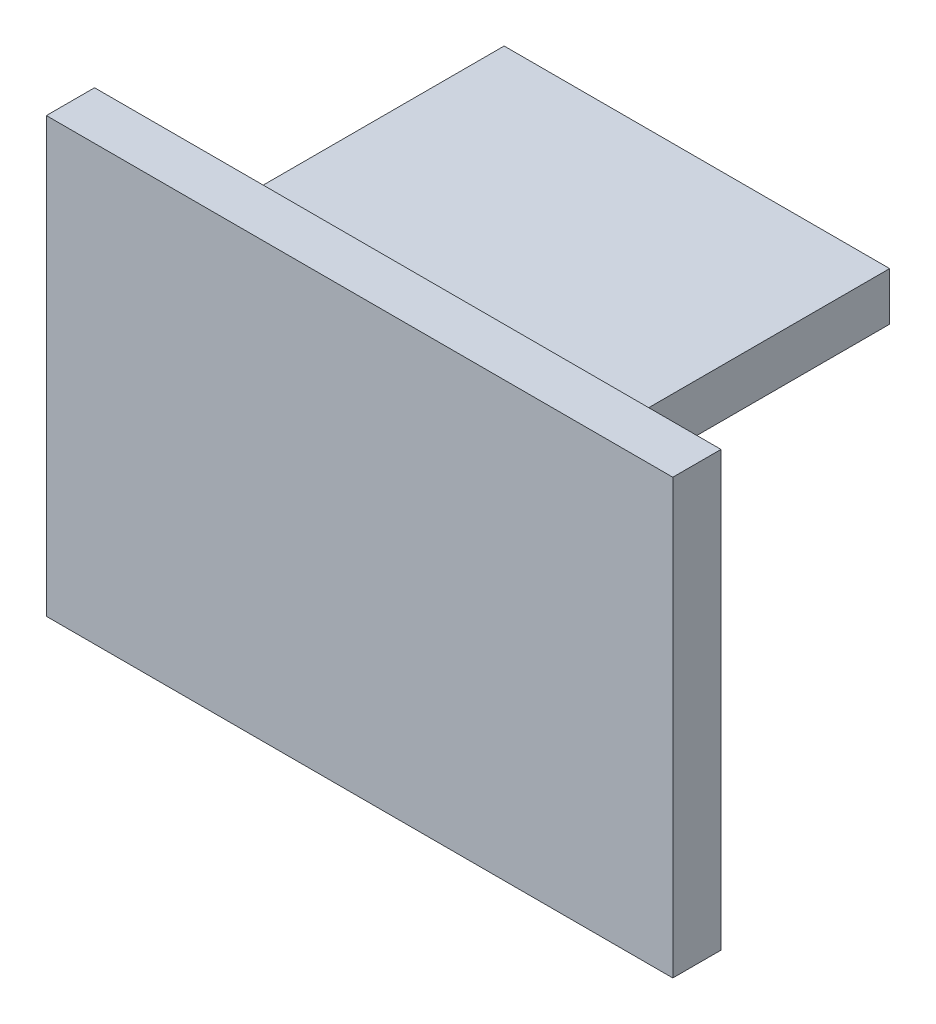
ISO-10303-21;
HEADER;
FILE_DESCRIPTION(('STEP AP214'),'2;1');
FILE_NAME('part.step','',(''),(''),'','','');
FILE_SCHEMA(('AUTOMOTIVE_DESIGN { 1 0 10303 214 1 1 1 1 }'));
ENDSEC;
DATA;
#1=APPLICATION_CONTEXT('core data for automotive mechanical design processes');
#2=APPLICATION_PROTOCOL_DEFINITION('international standard','automotive_design',2000,#1);
#3=PRODUCT_CONTEXT('',#1,'mechanical');
#4=PRODUCT('Part','Part','',(#3));
#5=PRODUCT_RELATED_PRODUCT_CATEGORY('part','',(#4));
#6=PRODUCT_DEFINITION_FORMATION('','',#4);
#7=PRODUCT_DEFINITION_CONTEXT('part definition',#1,'design');
#8=PRODUCT_DEFINITION('design','',#6,#7);
#9=PRODUCT_DEFINITION_SHAPE('','',#8);
#10=(LENGTH_UNIT() NAMED_UNIT(*) SI_UNIT(.MILLI.,.METRE.));
#11=(NAMED_UNIT(*) PLANE_ANGLE_UNIT() SI_UNIT($,.RADIAN.));
#12=(NAMED_UNIT(*) SI_UNIT($,.STERADIAN.) SOLID_ANGLE_UNIT());
#13=UNCERTAINTY_MEASURE_WITH_UNIT(LENGTH_MEASURE(1.E-05),#10,'distance_accuracy_value','');
#14=(GEOMETRIC_REPRESENTATION_CONTEXT(3) GLOBAL_UNCERTAINTY_ASSIGNED_CONTEXT((#13)) GLOBAL_UNIT_ASSIGNED_CONTEXT((#10,
#11,#12)) REPRESENTATION_CONTEXT('',''));
#15=CARTESIAN_POINT('',(0.,0.,0.));
#16=DIRECTION('',(0.,0.,1.));
#17=DIRECTION('',(1.,0.,0.));
#18=AXIS2_PLACEMENT_3D('',#15,#16,#17);
#19=CARTESIAN_POINT('',(0.,0.,0.));
#20=DIRECTION('',(0.,0.,1.));
#21=DIRECTION('',(1.,0.,0.));
#22=AXIS2_PLACEMENT_3D('',#19,#20,#21);
#23=PLANE('',#22);
#24=DIRECTION('',(-1.,0.,0.));
#25=VECTOR('',#24,1.);
#26=CARTESIAN_POINT('',(13.,18.,0.));
#27=LINE('',#26,#25);
#28=CARTESIAN_POINT('',(13.,18.,0.));
#29=VERTEX_POINT('',#28);
#30=CARTESIAN_POINT('',(-13.,18.,0.));
#31=VERTEX_POINT('',#30);
#32=EDGE_CURVE('E119',#29,#31,#27,.T.);
#33=ORIENTED_EDGE('',*,*,#32,.F.);
#34=DIRECTION('',(0.,1.,0.));
#35=VECTOR('',#34,1.);
#36=CARTESIAN_POINT('',(13.,0.,0.));
#37=LINE('',#36,#35);
#38=CARTESIAN_POINT('',(13.,0.,0.));
#39=VERTEX_POINT('',#38);
#40=EDGE_CURVE('E132',#39,#29,#37,.T.);
#41=ORIENTED_EDGE('',*,*,#40,.F.);
#42=DIRECTION('',(1.,0.,0.));
#43=VECTOR('',#42,1.);
#44=CARTESIAN_POINT('',(-13.,0.,0.));
#45=LINE('',#44,#43);
#46=CARTESIAN_POINT('',(-13.,0.,0.));
#47=VERTEX_POINT('',#46);
#48=EDGE_CURVE('E140',#47,#39,#45,.T.);
#49=ORIENTED_EDGE('',*,*,#48,.F.);
#50=DIRECTION('',(0.,-1.,0.));
#51=VECTOR('',#50,1.);
#52=CARTESIAN_POINT('',(-13.,18.,0.));
#53=LINE('',#52,#51);
#54=EDGE_CURVE('E122',#31,#47,#53,.T.);
#55=ORIENTED_EDGE('',*,*,#54,.F.);
#56=EDGE_LOOP('',(#33,#41,#49,#55));
#57=FACE_BOUND('',#56,.T.);
#58=DIRECTION('',(-1.,0.,0.));
#59=VECTOR('',#58,1.);
#60=CARTESIAN_POINT('',(-8.,14.,0.));
#61=LINE('',#60,#59);
#62=CARTESIAN_POINT('',(8.,14.,0.));
#63=VERTEX_POINT('',#62);
#64=CARTESIAN_POINT('',(-8.,14.,0.));
#65=VERTEX_POINT('',#64);
#66=EDGE_CURVE('E118',#63,#65,#61,.T.);
#67=ORIENTED_EDGE('',*,*,#66,.F.);
#68=DIRECTION('',(0.,-1.,0.));
#69=VECTOR('',#68,1.);
#70=CARTESIAN_POINT('',(8.,14.,0.));
#71=LINE('',#70,#69);
#72=CARTESIAN_POINT('',(8.,16.,0.));
#73=VERTEX_POINT('',#72);
#74=EDGE_CURVE('E115',#73,#63,#71,.T.);
#75=ORIENTED_EDGE('',*,*,#74,.F.);
#76=DIRECTION('',(1.,0.,0.));
#77=VECTOR('',#76,1.);
#78=CARTESIAN_POINT('',(8.,16.,0.));
#79=LINE('',#78,#77);
#80=CARTESIAN_POINT('',(-8.,16.,0.));
#81=VERTEX_POINT('',#80);
#82=EDGE_CURVE('E53',#81,#73,#79,.T.);
#83=ORIENTED_EDGE('',*,*,#82,.F.);
#84=DIRECTION('',(0.,1.,0.));
#85=VECTOR('',#84,1.);
#86=CARTESIAN_POINT('',(-8.,16.,0.));
#87=LINE('',#86,#85);
#88=EDGE_CURVE('E48',#65,#81,#87,.T.);
#89=ORIENTED_EDGE('',*,*,#88,.F.);
#90=EDGE_LOOP('',(#67,#75,#83,#89));
#91=FACE_BOUND('',#90,.T.);
#92=ADVANCED_FACE('F33',(#57,#91),#23,.F.);
#93=CARTESIAN_POINT('',(13.,18.,2.));
#94=DIRECTION('',(0.,-1.,0.));
#95=DIRECTION('',(0.,0.,-1.));
#96=AXIS2_PLACEMENT_3D('',#93,#94,#95);
#97=PLANE('',#96);
#98=ORIENTED_EDGE('',*,*,#32,.T.);
#99=DIRECTION('',(0.,0.,-1.));
#100=VECTOR('',#99,1.);
#101=CARTESIAN_POINT('',(-13.,18.,2.));
#102=LINE('',#101,#100);
#103=CARTESIAN_POINT('',(-13.,18.,2.));
#104=VERTEX_POINT('',#103);
#105=EDGE_CURVE('E11',#104,#31,#102,.T.);
#106=ORIENTED_EDGE('',*,*,#105,.F.);
#107=DIRECTION('',(-1.,0.,0.));
#108=VECTOR('',#107,1.);
#109=CARTESIAN_POINT('',(13.,18.,2.));
#110=LINE('',#109,#108);
#111=CARTESIAN_POINT('',(13.,18.,2.));
#112=VERTEX_POINT('',#111);
#113=EDGE_CURVE('E128',#112,#104,#110,.T.);
#114=ORIENTED_EDGE('',*,*,#113,.F.);
#115=DIRECTION('',(0.,0.,-1.));
#116=VECTOR('',#115,1.);
#117=CARTESIAN_POINT('',(13.,18.,2.));
#118=LINE('',#117,#116);
#119=EDGE_CURVE('E137',#112,#29,#118,.T.);
#120=ORIENTED_EDGE('',*,*,#119,.T.);
#121=EDGE_LOOP('',(#98,#106,#114,#120));
#122=FACE_BOUND('',#121,.T.);
#123=ADVANCED_FACE('F35',(#122),#97,.F.);
#124=CARTESIAN_POINT('',(-13.,18.,2.));
#125=DIRECTION('',(1.,0.,0.));
#126=DIRECTION('',(0.,0.,-1.));
#127=AXIS2_PLACEMENT_3D('',#124,#125,#126);
#128=PLANE('',#127);
#129=ORIENTED_EDGE('',*,*,#54,.T.);
#130=DIRECTION('',(0.,0.,-1.));
#131=VECTOR('',#130,1.);
#132=CARTESIAN_POINT('',(-13.,0.,2.));
#133=LINE('',#132,#131);
#134=CARTESIAN_POINT('',(-13.,0.,2.));
#135=VERTEX_POINT('',#134);
#136=EDGE_CURVE('E41',#135,#47,#133,.T.);
#137=ORIENTED_EDGE('',*,*,#136,.F.);
#138=DIRECTION('',(0.,-1.,0.));
#139=VECTOR('',#138,1.);
#140=CARTESIAN_POINT('',(-13.,18.,2.));
#141=LINE('',#140,#139);
#142=EDGE_CURVE('E131',#104,#135,#141,.T.);
#143=ORIENTED_EDGE('',*,*,#142,.F.);
#144=ORIENTED_EDGE('',*,*,#105,.T.);
#145=EDGE_LOOP('',(#129,#137,#143,#144));
#146=FACE_BOUND('',#145,.T.);
#147=ADVANCED_FACE('F167',(#146),#128,.F.);
#148=CARTESIAN_POINT('',(-13.,0.,2.));
#149=DIRECTION('',(0.,1.,0.));
#150=DIRECTION('',(0.,0.,1.));
#151=AXIS2_PLACEMENT_3D('',#148,#149,#150);
#152=PLANE('',#151);
#153=ORIENTED_EDGE('',*,*,#48,.T.);
#154=DIRECTION('',(0.,0.,-1.));
#155=VECTOR('',#154,1.);
#156=CARTESIAN_POINT('',(13.,0.,2.));
#157=LINE('',#156,#155);
#158=CARTESIAN_POINT('',(13.,0.,2.));
#159=VERTEX_POINT('',#158);
#160=EDGE_CURVE('E145',#159,#39,#157,.T.);
#161=ORIENTED_EDGE('',*,*,#160,.F.);
#162=DIRECTION('',(1.,0.,0.));
#163=VECTOR('',#162,1.);
#164=CARTESIAN_POINT('',(-13.,0.,2.));
#165=LINE('',#164,#163);
#166=EDGE_CURVE('E134',#135,#159,#165,.T.);
#167=ORIENTED_EDGE('',*,*,#166,.F.);
#168=ORIENTED_EDGE('',*,*,#136,.T.);
#169=EDGE_LOOP('',(#153,#161,#167,#168));
#170=FACE_BOUND('',#169,.T.);
#171=ADVANCED_FACE('F152',(#170),#152,.F.);
#172=CARTESIAN_POINT('',(13.,0.,2.));
#173=DIRECTION('',(-1.,0.,0.));
#174=DIRECTION('',(0.,0.,1.));
#175=AXIS2_PLACEMENT_3D('',#172,#173,#174);
#176=PLANE('',#175);
#177=ORIENTED_EDGE('',*,*,#40,.T.);
#178=ORIENTED_EDGE('',*,*,#119,.F.);
#179=DIRECTION('',(0.,1.,0.));
#180=VECTOR('',#179,1.);
#181=CARTESIAN_POINT('',(13.,0.,2.));
#182=LINE('',#181,#180);
#183=EDGE_CURVE('E136',#159,#112,#182,.T.);
#184=ORIENTED_EDGE('',*,*,#183,.F.);
#185=ORIENTED_EDGE('',*,*,#160,.T.);
#186=EDGE_LOOP('',(#177,#178,#184,#185));
#187=FACE_BOUND('',#186,.T.);
#188=ADVANCED_FACE('F160',(#187),#176,.F.);
#189=CARTESIAN_POINT('',(0.,0.,2.));
#190=DIRECTION('',(0.,0.,1.));
#191=DIRECTION('',(1.,0.,0.));
#192=AXIS2_PLACEMENT_3D('',#189,#190,#191);
#193=PLANE('',#192);
#194=ORIENTED_EDGE('',*,*,#113,.T.);
#195=ORIENTED_EDGE('',*,*,#142,.T.);
#196=ORIENTED_EDGE('',*,*,#166,.T.);
#197=ORIENTED_EDGE('',*,*,#183,.T.);
#198=EDGE_LOOP('',(#194,#195,#196,#197));
#199=FACE_BOUND('',#198,.T.);
#200=ADVANCED_FACE('F166',(#199),#193,.T.);
#201=CARTESIAN_POINT('',(-8.,14.,-12.));
#202=DIRECTION('',(0.,1.,0.));
#203=DIRECTION('',(0.,0.,1.));
#204=AXIS2_PLACEMENT_3D('',#201,#202,#203);
#205=PLANE('',#204);
#206=ORIENTED_EDGE('',*,*,#66,.T.);
#207=DIRECTION('',(0.,0.,1.));
#208=VECTOR('',#207,1.);
#209=CARTESIAN_POINT('',(-8.,14.,-12.));
#210=LINE('',#209,#208);
#211=CARTESIAN_POINT('',(-8.,14.,-12.));
#212=VERTEX_POINT('',#211);
#213=EDGE_CURVE('E99',#212,#65,#210,.T.);
#214=ORIENTED_EDGE('',*,*,#213,.F.);
#215=DIRECTION('',(-1.,0.,0.));
#216=VECTOR('',#215,1.);
#217=CARTESIAN_POINT('',(-8.,14.,-12.));
#218=LINE('',#217,#216);
#219=CARTESIAN_POINT('',(8.,14.,-12.));
#220=VERTEX_POINT('',#219);
#221=EDGE_CURVE('E106',#220,#212,#218,.T.);
#222=ORIENTED_EDGE('',*,*,#221,.F.);
#223=DIRECTION('',(0.,0.,1.));
#224=VECTOR('',#223,1.);
#225=CARTESIAN_POINT('',(8.,14.,-12.));
#226=LINE('',#225,#224);
#227=EDGE_CURVE('E260',#220,#63,#226,.T.);
#228=ORIENTED_EDGE('',*,*,#227,.T.);
#229=EDGE_LOOP('',(#206,#214,#222,#228));
#230=FACE_BOUND('',#229,.T.);
#231=ADVANCED_FACE('F117',(#230),#205,.F.);
#232=CARTESIAN_POINT('',(-8.,16.,-12.));
#233=DIRECTION('',(1.,0.,0.));
#234=DIRECTION('',(0.,0.,-1.));
#235=AXIS2_PLACEMENT_3D('',#232,#233,#234);
#236=PLANE('',#235);
#237=ORIENTED_EDGE('',*,*,#88,.T.);
#238=DIRECTION('',(0.,0.,1.));
#239=VECTOR('',#238,1.);
#240=CARTESIAN_POINT('',(-8.,16.,-12.));
#241=LINE('',#240,#239);
#242=CARTESIAN_POINT('',(-8.,16.,-12.));
#243=VERTEX_POINT('',#242);
#244=EDGE_CURVE('E102',#243,#81,#241,.T.);
#245=ORIENTED_EDGE('',*,*,#244,.F.);
#246=DIRECTION('',(0.,1.,0.));
#247=VECTOR('',#246,1.);
#248=CARTESIAN_POINT('',(-8.,16.,-12.));
#249=LINE('',#248,#247);
#250=EDGE_CURVE('E95',#212,#243,#249,.T.);
#251=ORIENTED_EDGE('',*,*,#250,.F.);
#252=ORIENTED_EDGE('',*,*,#213,.T.);
#253=EDGE_LOOP('',(#237,#245,#251,#252));
#254=FACE_BOUND('',#253,.T.);
#255=ADVANCED_FACE('F97',(#254),#236,.F.);
#256=CARTESIAN_POINT('',(8.,16.,-12.));
#257=DIRECTION('',(0.,-1.,0.));
#258=DIRECTION('',(1.,0.,0.));
#259=AXIS2_PLACEMENT_3D('',#256,#257,#258);
#260=PLANE('',#259);
#261=ORIENTED_EDGE('',*,*,#82,.T.);
#262=DIRECTION('',(0.,0.,1.));
#263=VECTOR('',#262,1.);
#264=CARTESIAN_POINT('',(8.,16.,-12.));
#265=LINE('',#264,#263);
#266=CARTESIAN_POINT('',(8.,16.,-12.));
#267=VERTEX_POINT('',#266);
#268=EDGE_CURVE('E124',#267,#73,#265,.T.);
#269=ORIENTED_EDGE('',*,*,#268,.F.);
#270=DIRECTION('',(1.,0.,0.));
#271=VECTOR('',#270,1.);
#272=CARTESIAN_POINT('',(8.,16.,-12.));
#273=LINE('',#272,#271);
#274=EDGE_CURVE('E105',#243,#267,#273,.T.);
#275=ORIENTED_EDGE('',*,*,#274,.F.);
#276=ORIENTED_EDGE('',*,*,#244,.T.);
#277=EDGE_LOOP('',(#261,#269,#275,#276));
#278=FACE_BOUND('',#277,.T.);
#279=ADVANCED_FACE('F191',(#278),#260,.F.);
#280=CARTESIAN_POINT('',(8.,14.,-12.));
#281=DIRECTION('',(-1.,0.,0.));
#282=DIRECTION('',(0.,0.,1.));
#283=AXIS2_PLACEMENT_3D('',#280,#281,#282);
#284=PLANE('',#283);
#285=ORIENTED_EDGE('',*,*,#74,.T.);
#286=ORIENTED_EDGE('',*,*,#227,.F.);
#287=DIRECTION('',(0.,-1.,0.));
#288=VECTOR('',#287,1.);
#289=CARTESIAN_POINT('',(8.,14.,-12.));
#290=LINE('',#289,#288);
#291=EDGE_CURVE('E111',#267,#220,#290,.T.);
#292=ORIENTED_EDGE('',*,*,#291,.F.);
#293=ORIENTED_EDGE('',*,*,#268,.T.);
#294=EDGE_LOOP('',(#285,#286,#292,#293));
#295=FACE_BOUND('',#294,.T.);
#296=ADVANCED_FACE('F196',(#295),#284,.F.);
#297=CARTESIAN_POINT('',(0.,0.,-12.));
#298=DIRECTION('',(0.,0.,1.));
#299=DIRECTION('',(1.,0.,0.));
#300=AXIS2_PLACEMENT_3D('',#297,#298,#299);
#301=PLANE('',#300);
#302=ORIENTED_EDGE('',*,*,#221,.T.);
#303=ORIENTED_EDGE('',*,*,#250,.T.);
#304=ORIENTED_EDGE('',*,*,#274,.T.);
#305=ORIENTED_EDGE('',*,*,#291,.T.);
#306=EDGE_LOOP('',(#302,#303,#304,#305));
#307=FACE_BOUND('',#306,.T.);
#308=ADVANCED_FACE('F109',(#307),#301,.F.);
#309=CLOSED_SHELL('',(#92,#123,#147,#171,#188,#200,#231,#255,#279,#296,#308));
#310=MANIFOLD_SOLID_BREP('B2',#309);
#311=ADVANCED_BREP_SHAPE_REPRESENTATION('',(#18,#310),#14);
#312=SHAPE_DEFINITION_REPRESENTATION(#9,#311);
ENDSEC;
END-ISO-10303-21;
